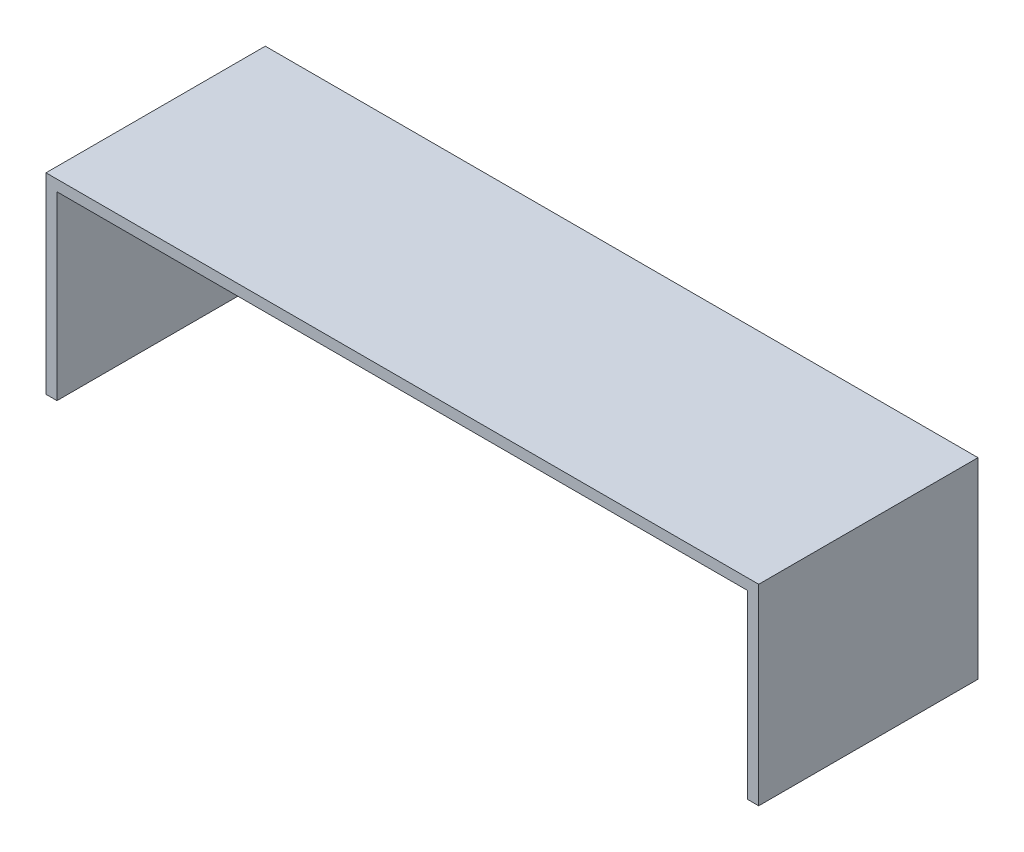
ISO-10303-21;
HEADER;
FILE_DESCRIPTION(('STEP AP214'),'2;1');
FILE_NAME('part.step','',(''),(''),'','','');
FILE_SCHEMA(('AUTOMOTIVE_DESIGN { 1 0 10303 214 1 1 1 1 }'));
ENDSEC;
DATA;
#1=APPLICATION_CONTEXT('core data for automotive mechanical design processes');
#2=APPLICATION_PROTOCOL_DEFINITION('international standard','automotive_design',2000,#1);
#3=PRODUCT_CONTEXT('',#1,'mechanical');
#4=PRODUCT('Part','Part','',(#3));
#5=PRODUCT_RELATED_PRODUCT_CATEGORY('part','',(#4));
#6=PRODUCT_DEFINITION_FORMATION('','',#4);
#7=PRODUCT_DEFINITION_CONTEXT('part definition',#1,'design');
#8=PRODUCT_DEFINITION('design','',#6,#7);
#9=PRODUCT_DEFINITION_SHAPE('','',#8);
#10=(LENGTH_UNIT() NAMED_UNIT(*) SI_UNIT(.MILLI.,.METRE.));
#11=(NAMED_UNIT(*) PLANE_ANGLE_UNIT() SI_UNIT($,.RADIAN.));
#12=(NAMED_UNIT(*) SI_UNIT($,.STERADIAN.) SOLID_ANGLE_UNIT());
#13=UNCERTAINTY_MEASURE_WITH_UNIT(LENGTH_MEASURE(1.E-05),#10,'distance_accuracy_value','');
#14=(GEOMETRIC_REPRESENTATION_CONTEXT(3) GLOBAL_UNCERTAINTY_ASSIGNED_CONTEXT((#13)) GLOBAL_UNIT_ASSIGNED_CONTEXT((#10,
#11,#12)) REPRESENTATION_CONTEXT('',''));
#15=CARTESIAN_POINT('',(0.,0.,0.));
#16=DIRECTION('',(0.,0.,1.));
#17=DIRECTION('',(1.,0.,0.));
#18=AXIS2_PLACEMENT_3D('',#15,#16,#17);
#19=CARTESIAN_POINT('',(0.,0.,0.));
#20=DIRECTION('',(0.,-1.,0.));
#21=DIRECTION('',(0.,0.,-1.));
#22=AXIS2_PLACEMENT_3D('',#19,#20,#21);
#23=PLANE('',#22);
#24=DIRECTION('',(-1.,0.,0.));
#25=VECTOR('',#24,1.);
#26=CARTESIAN_POINT('',(0.,0.,-40.));
#27=LINE('',#26,#25);
#28=CARTESIAN_POINT('',(128.,0.,-40.));
#29=VERTEX_POINT('',#28);
#30=CARTESIAN_POINT('',(2.,0.,-40.));
#31=VERTEX_POINT('',#30);
#32=EDGE_CURVE('E151',#29,#31,#27,.T.);
#33=ORIENTED_EDGE('',*,*,#32,.F.);
#34=DIRECTION('',(0.,0.,1.));
#35=VECTOR('',#34,1.);
#36=CARTESIAN_POINT('',(128.,0.,0.));
#37=LINE('',#36,#35);
#38=CARTESIAN_POINT('',(128.,0.,0.));
#39=VERTEX_POINT('',#38);
#40=EDGE_CURVE('E129',#29,#39,#37,.T.);
#41=ORIENTED_EDGE('',*,*,#40,.T.);
#42=DIRECTION('',(1.,0.,0.));
#43=VECTOR('',#42,1.);
#44=CARTESIAN_POINT('',(0.,0.,0.));
#45=LINE('',#44,#43);
#46=CARTESIAN_POINT('',(2.,0.,0.));
#47=VERTEX_POINT('',#46);
#48=EDGE_CURVE('E124',#47,#39,#45,.T.);
#49=ORIENTED_EDGE('',*,*,#48,.F.);
#50=DIRECTION('',(0.,0.,-1.));
#51=VECTOR('',#50,1.);
#52=CARTESIAN_POINT('',(2.,0.,0.));
#53=LINE('',#52,#51);
#54=EDGE_CURVE('E11',#47,#31,#53,.T.);
#55=ORIENTED_EDGE('',*,*,#54,.T.);
#56=EDGE_LOOP('',(#33,#41,#49,#55));
#57=FACE_BOUND('',#56,.T.);
#58=ADVANCED_FACE('F34',(#57),#23,.T.);
#59=CARTESIAN_POINT('',(0.,2.,0.));
#60=DIRECTION('',(1.,0.,0.));
#61=DIRECTION('',(0.,0.,-1.));
#62=AXIS2_PLACEMENT_3D('',#59,#60,#61);
#63=PLANE('',#62);
#64=DIRECTION('',(0.,-1.,0.));
#65=VECTOR('',#64,1.);
#66=CARTESIAN_POINT('',(0.,2.,-40.));
#67=LINE('',#66,#65);
#68=CARTESIAN_POINT('',(0.,2.,-40.));
#69=VERTEX_POINT('',#68);
#70=CARTESIAN_POINT('',(0.,-33.,-40.));
#71=VERTEX_POINT('',#70);
#72=EDGE_CURVE('E155',#69,#71,#67,.T.);
#73=ORIENTED_EDGE('',*,*,#72,.T.);
#74=DIRECTION('',(0.,0.,1.));
#75=VECTOR('',#74,1.);
#76=CARTESIAN_POINT('',(0.,-33.,-40.));
#77=LINE('',#76,#75);
#78=CARTESIAN_POINT('',(0.,-33.,0.));
#79=VERTEX_POINT('',#78);
#80=EDGE_CURVE('E132',#71,#79,#77,.T.);
#81=ORIENTED_EDGE('',*,*,#80,.T.);
#82=DIRECTION('',(0.,-1.,0.));
#83=VECTOR('',#82,1.);
#84=CARTESIAN_POINT('',(0.,2.,0.));
#85=LINE('',#84,#83);
#86=CARTESIAN_POINT('',(0.,2.,0.));
#87=VERTEX_POINT('',#86);
#88=EDGE_CURVE('E42',#87,#79,#85,.T.);
#89=ORIENTED_EDGE('',*,*,#88,.F.);
#90=DIRECTION('',(0.,0.,1.));
#91=VECTOR('',#90,1.);
#92=CARTESIAN_POINT('',(0.,2.,0.));
#93=LINE('',#92,#91);
#94=EDGE_CURVE('E148',#69,#87,#93,.T.);
#95=ORIENTED_EDGE('',*,*,#94,.F.);
#96=EDGE_LOOP('',(#73,#81,#89,#95));
#97=FACE_BOUND('',#96,.T.);
#98=ADVANCED_FACE('F36',(#97),#63,.F.);
#99=CARTESIAN_POINT('',(0.,2.,0.));
#100=DIRECTION('',(0.,0.,-1.));
#101=DIRECTION('',(-1.,0.,0.));
#102=AXIS2_PLACEMENT_3D('',#99,#100,#101);
#103=PLANE('',#102);
#104=DIRECTION('',(0.,-1.,0.));
#105=VECTOR('',#104,1.);
#106=CARTESIAN_POINT('',(130.,2.,0.));
#107=LINE('',#106,#105);
#108=CARTESIAN_POINT('',(130.,2.,0.));
#109=VERTEX_POINT('',#108);
#110=CARTESIAN_POINT('',(130.,-33.,0.));
#111=VERTEX_POINT('',#110);
#112=EDGE_CURVE('E161',#109,#111,#107,.T.);
#113=ORIENTED_EDGE('',*,*,#112,.F.);
#114=DIRECTION('',(1.,0.,0.));
#115=VECTOR('',#114,1.);
#116=CARTESIAN_POINT('',(0.,2.,0.));
#117=LINE('',#116,#115);
#118=EDGE_CURVE('E150',#87,#109,#117,.T.);
#119=ORIENTED_EDGE('',*,*,#118,.F.);
#120=ORIENTED_EDGE('',*,*,#88,.T.);
#121=DIRECTION('',(-1.,0.,0.));
#122=VECTOR('',#121,1.);
#123=CARTESIAN_POINT('',(2.,-33.,0.));
#124=LINE('',#123,#122);
#125=CARTESIAN_POINT('',(2.,-33.,0.));
#126=VERTEX_POINT('',#125);
#127=EDGE_CURVE('E143',#126,#79,#124,.T.);
#128=ORIENTED_EDGE('',*,*,#127,.F.);
#129=DIRECTION('',(0.,1.,0.));
#130=VECTOR('',#129,1.);
#131=CARTESIAN_POINT('',(2.,2.,0.));
#132=LINE('',#131,#130);
#133=EDGE_CURVE('E138',#126,#47,#132,.T.);
#134=ORIENTED_EDGE('',*,*,#133,.T.);
#135=ORIENTED_EDGE('',*,*,#48,.T.);
#136=DIRECTION('',(0.,1.,0.));
#137=VECTOR('',#136,1.);
#138=CARTESIAN_POINT('',(128.,2.,0.));
#139=LINE('',#138,#137);
#140=CARTESIAN_POINT('',(128.,-33.,0.));
#141=VERTEX_POINT('',#140);
#142=EDGE_CURVE('E102',#141,#39,#139,.T.);
#143=ORIENTED_EDGE('',*,*,#142,.F.);
#144=DIRECTION('',(1.,0.,0.));
#145=VECTOR('',#144,1.);
#146=CARTESIAN_POINT('',(128.,-33.,0.));
#147=LINE('',#146,#145);
#148=EDGE_CURVE('E109',#141,#111,#147,.T.);
#149=ORIENTED_EDGE('',*,*,#148,.T.);
#150=EDGE_LOOP('',(#113,#119,#120,#128,#134,#135,#143,#149));
#151=FACE_BOUND('',#150,.T.);
#152=ADVANCED_FACE('F121',(#151),#103,.F.);
#153=CARTESIAN_POINT('',(130.,2.,0.));
#154=DIRECTION('',(-1.,0.,0.));
#155=DIRECTION('',(0.,0.,1.));
#156=AXIS2_PLACEMENT_3D('',#153,#154,#155);
#157=PLANE('',#156);
#158=ORIENTED_EDGE('',*,*,#112,.T.);
#159=DIRECTION('',(0.,0.,1.));
#160=VECTOR('',#159,1.);
#161=CARTESIAN_POINT('',(130.,-33.,-40.));
#162=LINE('',#161,#160);
#163=CARTESIAN_POINT('',(130.,-33.,-40.));
#164=VERTEX_POINT('',#163);
#165=EDGE_CURVE('E115',#164,#111,#162,.T.);
#166=ORIENTED_EDGE('',*,*,#165,.F.);
#167=DIRECTION('',(0.,-1.,0.));
#168=VECTOR('',#167,1.);
#169=CARTESIAN_POINT('',(130.,2.,-40.));
#170=LINE('',#169,#168);
#171=CARTESIAN_POINT('',(130.,2.,-40.));
#172=VERTEX_POINT('',#171);
#173=EDGE_CURVE('E159',#172,#164,#170,.T.);
#174=ORIENTED_EDGE('',*,*,#173,.F.);
#175=DIRECTION('',(0.,0.,-1.));
#176=VECTOR('',#175,1.);
#177=CARTESIAN_POINT('',(130.,2.,0.));
#178=LINE('',#177,#176);
#179=EDGE_CURVE('E54',#109,#172,#178,.T.);
#180=ORIENTED_EDGE('',*,*,#179,.F.);
#181=EDGE_LOOP('',(#158,#166,#174,#180));
#182=FACE_BOUND('',#181,.T.);
#183=ADVANCED_FACE('F179',(#182),#157,.F.);
#184=CARTESIAN_POINT('',(0.,2.,-40.));
#185=DIRECTION('',(0.,0.,1.));
#186=DIRECTION('',(1.,0.,0.));
#187=AXIS2_PLACEMENT_3D('',#184,#185,#186);
#188=PLANE('',#187);
#189=ORIENTED_EDGE('',*,*,#173,.T.);
#190=DIRECTION('',(1.,0.,0.));
#191=VECTOR('',#190,1.);
#192=CARTESIAN_POINT('',(128.,-33.,-40.));
#193=LINE('',#192,#191);
#194=CARTESIAN_POINT('',(128.,-33.,-40.));
#195=VERTEX_POINT('',#194);
#196=EDGE_CURVE('E118',#195,#164,#193,.T.);
#197=ORIENTED_EDGE('',*,*,#196,.F.);
#198=DIRECTION('',(0.,-1.,0.));
#199=VECTOR('',#198,1.);
#200=CARTESIAN_POINT('',(128.,2.,-40.));
#201=LINE('',#200,#199);
#202=EDGE_CURVE('E105',#29,#195,#201,.T.);
#203=ORIENTED_EDGE('',*,*,#202,.F.);
#204=ORIENTED_EDGE('',*,*,#32,.T.);
#205=DIRECTION('',(0.,-1.,0.));
#206=VECTOR('',#205,1.);
#207=CARTESIAN_POINT('',(2.,2.,-40.));
#208=LINE('',#207,#206);
#209=CARTESIAN_POINT('',(2.,-33.,-40.));
#210=VERTEX_POINT('',#209);
#211=EDGE_CURVE('E133',#31,#210,#208,.T.);
#212=ORIENTED_EDGE('',*,*,#211,.T.);
#213=DIRECTION('',(-1.,0.,0.));
#214=VECTOR('',#213,1.);
#215=CARTESIAN_POINT('',(2.,-33.,-40.));
#216=LINE('',#215,#214);
#217=EDGE_CURVE('E140',#210,#71,#216,.T.);
#218=ORIENTED_EDGE('',*,*,#217,.T.);
#219=ORIENTED_EDGE('',*,*,#72,.F.);
#220=DIRECTION('',(-1.,0.,0.));
#221=VECTOR('',#220,1.);
#222=CARTESIAN_POINT('',(0.,2.,-40.));
#223=LINE('',#222,#221);
#224=EDGE_CURVE('E49',#172,#69,#223,.T.);
#225=ORIENTED_EDGE('',*,*,#224,.F.);
#226=EDGE_LOOP('',(#189,#197,#203,#204,#212,#218,#219,#225));
#227=FACE_BOUND('',#226,.T.);
#228=ADVANCED_FACE('F172',(#227),#188,.F.);
#229=CARTESIAN_POINT('',(0.,2.,0.));
#230=DIRECTION('',(0.,-1.,0.));
#231=DIRECTION('',(0.,0.,-1.));
#232=AXIS2_PLACEMENT_3D('',#229,#230,#231);
#233=PLANE('',#232);
#234=ORIENTED_EDGE('',*,*,#224,.T.);
#235=ORIENTED_EDGE('',*,*,#94,.T.);
#236=ORIENTED_EDGE('',*,*,#118,.T.);
#237=ORIENTED_EDGE('',*,*,#179,.T.);
#238=EDGE_LOOP('',(#234,#235,#236,#237));
#239=FACE_BOUND('',#238,.T.);
#240=ADVANCED_FACE('F186',(#239),#233,.F.);
#241=CARTESIAN_POINT('',(2.,-33.,-40.));
#242=DIRECTION('',(0.,-1.,0.));
#243=DIRECTION('',(0.,0.,-1.));
#244=AXIS2_PLACEMENT_3D('',#241,#242,#243);
#245=PLANE('',#244);
#246=ORIENTED_EDGE('',*,*,#80,.F.);
#247=ORIENTED_EDGE('',*,*,#217,.F.);
#248=DIRECTION('',(0.,0.,1.));
#249=VECTOR('',#248,1.);
#250=CARTESIAN_POINT('',(2.,-33.,-40.));
#251=LINE('',#250,#249);
#252=EDGE_CURVE('E135',#210,#126,#251,.T.);
#253=ORIENTED_EDGE('',*,*,#252,.T.);
#254=ORIENTED_EDGE('',*,*,#127,.T.);
#255=EDGE_LOOP('',(#246,#247,#253,#254));
#256=FACE_BOUND('',#255,.T.);
#257=ADVANCED_FACE('F168',(#256),#245,.T.);
#258=CARTESIAN_POINT('',(2.,0.,0.));
#259=DIRECTION('',(-1.,0.,0.));
#260=DIRECTION('',(0.,0.,1.));
#261=AXIS2_PLACEMENT_3D('',#258,#259,#260);
#262=PLANE('',#261);
#263=ORIENTED_EDGE('',*,*,#54,.F.);
#264=ORIENTED_EDGE('',*,*,#133,.F.);
#265=ORIENTED_EDGE('',*,*,#252,.F.);
#266=ORIENTED_EDGE('',*,*,#211,.F.);
#267=EDGE_LOOP('',(#263,#264,#265,#266));
#268=FACE_BOUND('',#267,.T.);
#269=ADVANCED_FACE('F175',(#268),#262,.F.);
#270=CARTESIAN_POINT('',(128.,-33.,-40.));
#271=DIRECTION('',(0.,1.,0.));
#272=DIRECTION('',(0.,0.,1.));
#273=AXIS2_PLACEMENT_3D('',#270,#271,#272);
#274=PLANE('',#273);
#275=ORIENTED_EDGE('',*,*,#165,.T.);
#276=ORIENTED_EDGE('',*,*,#148,.F.);
#277=DIRECTION('',(0.,0.,1.));
#278=VECTOR('',#277,1.);
#279=CARTESIAN_POINT('',(128.,-33.,-40.));
#280=LINE('',#279,#278);
#281=EDGE_CURVE('E98',#195,#141,#280,.T.);
#282=ORIENTED_EDGE('',*,*,#281,.F.);
#283=ORIENTED_EDGE('',*,*,#196,.T.);
#284=EDGE_LOOP('',(#275,#276,#282,#283));
#285=FACE_BOUND('',#284,.T.);
#286=ADVANCED_FACE('F113',(#285),#274,.F.);
#287=CARTESIAN_POINT('',(128.,0.,0.));
#288=DIRECTION('',(1.,0.,0.));
#289=DIRECTION('',(0.,0.,1.));
#290=AXIS2_PLACEMENT_3D('',#287,#288,#289);
#291=PLANE('',#290);
#292=ORIENTED_EDGE('',*,*,#40,.F.);
#293=ORIENTED_EDGE('',*,*,#202,.T.);
#294=ORIENTED_EDGE('',*,*,#281,.T.);
#295=ORIENTED_EDGE('',*,*,#142,.T.);
#296=EDGE_LOOP('',(#292,#293,#294,#295));
#297=FACE_BOUND('',#296,.T.);
#298=ADVANCED_FACE('F100',(#297),#291,.F.);
#299=CLOSED_SHELL('',(#58,#98,#152,#183,#228,#240,#257,#269,#286,#298));
#300=MANIFOLD_SOLID_BREP('B2',#299);
#301=ADVANCED_BREP_SHAPE_REPRESENTATION('',(#18,#300),#14);
#302=SHAPE_DEFINITION_REPRESENTATION(#9,#301);
ENDSEC;
END-ISO-10303-21;
